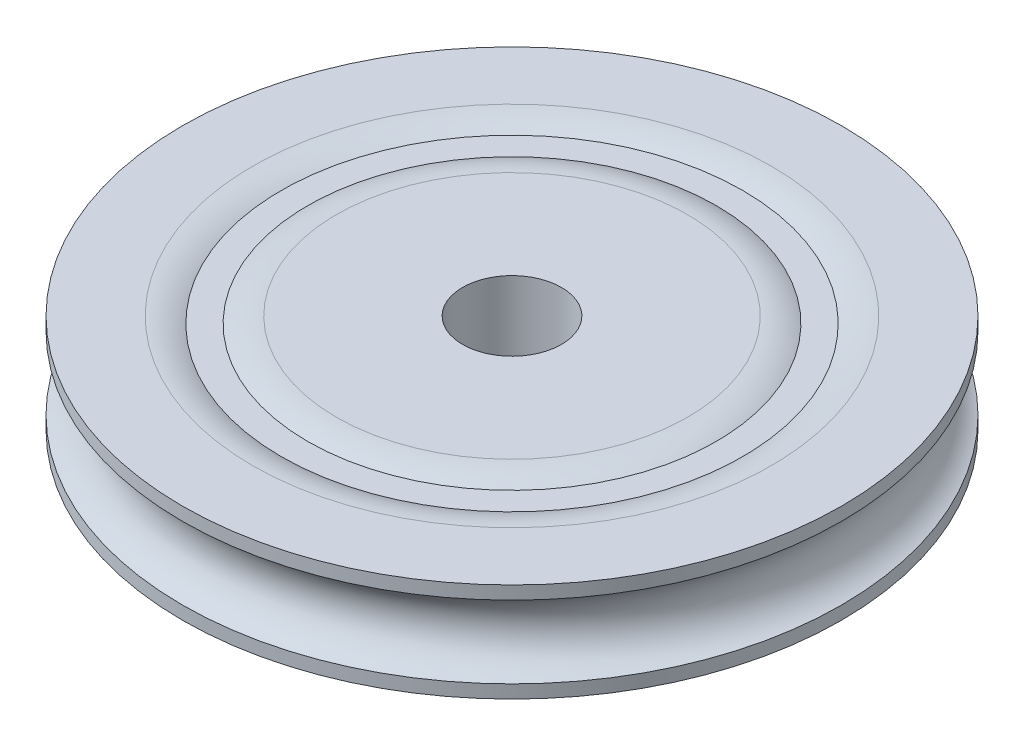
ISO-10303-21;
HEADER;
FILE_DESCRIPTION(('STEP AP214'),'2;1');
FILE_NAME('part.step','',(''),(''),'','','');
FILE_SCHEMA(('AUTOMOTIVE_DESIGN { 1 0 10303 214 1 1 1 1 }'));
ENDSEC;
DATA;
#1=APPLICATION_CONTEXT('core data for automotive mechanical design processes');
#2=APPLICATION_PROTOCOL_DEFINITION('international standard','automotive_design',2000,#1);
#3=PRODUCT_CONTEXT('',#1,'mechanical');
#4=PRODUCT('Part','Part','',(#3));
#5=PRODUCT_RELATED_PRODUCT_CATEGORY('part','',(#4));
#6=PRODUCT_DEFINITION_FORMATION('','',#4);
#7=PRODUCT_DEFINITION_CONTEXT('part definition',#1,'design');
#8=PRODUCT_DEFINITION('design','',#6,#7);
#9=PRODUCT_DEFINITION_SHAPE('','',#8);
#10=(LENGTH_UNIT() NAMED_UNIT(*) SI_UNIT(.MILLI.,.METRE.));
#11=(NAMED_UNIT(*) PLANE_ANGLE_UNIT() SI_UNIT($,.RADIAN.));
#12=(NAMED_UNIT(*) SI_UNIT($,.STERADIAN.) SOLID_ANGLE_UNIT());
#13=UNCERTAINTY_MEASURE_WITH_UNIT(LENGTH_MEASURE(1.E-05),#10,'distance_accuracy_value','');
#14=(GEOMETRIC_REPRESENTATION_CONTEXT(3) GLOBAL_UNCERTAINTY_ASSIGNED_CONTEXT((#13)) GLOBAL_UNIT_ASSIGNED_CONTEXT((#10,
#11,#12)) REPRESENTATION_CONTEXT('',''));
#15=CARTESIAN_POINT('',(0.,0.,0.));
#16=DIRECTION('',(0.,0.,1.));
#17=DIRECTION('',(1.,0.,0.));
#18=AXIS2_PLACEMENT_3D('',#15,#16,#17);
#19=CARTESIAN_POINT('',(0.,-7.49999999999994,0.));
#20=DIRECTION('',(0.,-1.,0.));
#21=DIRECTION('',(0.,0.,-1.));
#22=AXIS2_PLACEMENT_3D('',#19,#20,#21);
#23=PLANE('',#22);
#24=CARTESIAN_POINT('',(0.,-7.49999999999994,0.));
#25=DIRECTION('',(0.,-1.,0.));
#26=DIRECTION('',(0.,0.,-1.));
#27=AXIS2_PLACEMENT_3D('',#24,#25,#26);
#28=CIRCLE('',#27,7.5);
#29=CARTESIAN_POINT('',(0.,-7.49999999999992,-7.50000000000003));
#30=VERTEX_POINT('',#29);
#31=EDGE_CURVE('E76',#30,#30,#28,.T.);
#32=ORIENTED_EDGE('',*,*,#31,.F.);
#33=EDGE_LOOP('',(#32));
#34=FACE_BOUND('',#33,.T.);
#35=CARTESIAN_POINT('',(0.,-7.49999999999994,0.));
#36=DIRECTION('',(0.,-1.,0.));
#37=DIRECTION('',(0.,0.,-1.));
#38=AXIS2_PLACEMENT_3D('',#35,#36,#37);
#39=CIRCLE('',#38,26.6411010564592);
#40=CARTESIAN_POINT('',(0.,-7.49999999999985,-26.6411010564593));
#41=VERTEX_POINT('',#40);
#42=EDGE_CURVE('E10',#41,#41,#39,.T.);
#43=ORIENTED_EDGE('',*,*,#42,.T.);
#44=EDGE_LOOP('',(#43));
#45=FACE_BOUND('',#44,.T.);
#46=ADVANCED_FACE('F31',(#34,#45),#23,.T.);
#47=CARTESIAN_POINT('',(0.,-6.49999999999999,31.));
#48=DIRECTION('',(0.,-1.,0.));
#49=DIRECTION('',(0.,0.,-1.));
#50=AXIS2_PLACEMENT_3D('',#47,#48,#49);
#51=PLANE('',#50);
#52=CARTESIAN_POINT('',(0.,-6.4999999999999,0.));
#53=DIRECTION('',(0.,1.,0.));
#54=DIRECTION('',(0.,0.,1.));
#55=AXIS2_PLACEMENT_3D('',#52,#53,#54);
#56=CIRCLE('',#55,31.);
#57=CARTESIAN_POINT('',(0.,-6.5,31.));
#58=VERTEX_POINT('',#57);
#59=EDGE_CURVE('E51',#58,#58,#56,.T.);
#60=ORIENTED_EDGE('',*,*,#59,.T.);
#61=EDGE_LOOP('',(#60));
#62=FACE_BOUND('',#61,.T.);
#63=CARTESIAN_POINT('',(0.,-6.49999999999988,0.));
#64=DIRECTION('',(0.,1.,0.));
#65=DIRECTION('',(0.,0.,1.));
#66=AXIS2_PLACEMENT_3D('',#63,#64,#65);
#67=CIRCLE('',#66,35.);
#68=CARTESIAN_POINT('',(0.,-6.5,35.));
#69=VERTEX_POINT('',#68);
#70=EDGE_CURVE('E54',#69,#69,#67,.T.);
#71=ORIENTED_EDGE('',*,*,#70,.F.);
#72=EDGE_LOOP('',(#71));
#73=FACE_BOUND('',#72,.T.);
#74=ADVANCED_FACE('F92',(#62,#73),#51,.T.);
#75=CARTESIAN_POINT('',(0.,-7.49999999999998,34.9999999999999));
#76=DIRECTION('',(0.,-1.,0.));
#77=DIRECTION('',(0.,0.,-1.));
#78=AXIS2_PLACEMENT_3D('',#75,#76,#77);
#79=PLANE('',#78);
#80=CARTESIAN_POINT('',(0.,-7.49999999999986,0.));
#81=DIRECTION('',(0.,-1.,0.));
#82=DIRECTION('',(0.,0.,-1.));
#83=AXIS2_PLACEMENT_3D('',#80,#81,#82);
#84=CIRCLE('',#83,39.3588989435406);
#85=CARTESIAN_POINT('',(0.,-7.49999999999972,-39.3588989435406));
#86=VERTEX_POINT('',#85);
#87=EDGE_CURVE('E38',#86,#86,#84,.F.);
#88=ORIENTED_EDGE('',*,*,#87,.T.);
#89=EDGE_LOOP('',(#88));
#90=FACE_BOUND('',#89,.T.);
#91=CARTESIAN_POINT('',(0.,-7.49999999999984,0.));
#92=DIRECTION('',(0.,1.,0.));
#93=DIRECTION('',(0.,0.,1.));
#94=AXIS2_PLACEMENT_3D('',#91,#92,#93);
#95=CIRCLE('',#94,49.9999999999999);
#96=CARTESIAN_POINT('',(0.,-7.50000000000001,49.9999999999999));
#97=VERTEX_POINT('',#96);
#98=EDGE_CURVE('E57',#97,#97,#95,.T.);
#99=ORIENTED_EDGE('',*,*,#98,.F.);
#100=EDGE_LOOP('',(#99));
#101=FACE_BOUND('',#100,.T.);
#102=ADVANCED_FACE('F97',(#90,#101),#79,.T.);
#103=CARTESIAN_POINT('',(0.,55.4349174869901,1.90155570213063E-13));
#104=DIRECTION('',(0.,1.,0.));
#105=DIRECTION('',(0.,0.,1.));
#106=AXIS2_PLACEMENT_3D('',#103,#104,#105);
#107=CYLINDRICAL_SURFACE('',#106,49.9999999999999);
#108=ORIENTED_EDGE('',*,*,#98,.T.);
#109=EDGE_LOOP('',(#108));
#110=FACE_BOUND('',#109,.T.);
#111=CARTESIAN_POINT('',(0.,-5.49999999999985,0.));
#112=DIRECTION('',(0.,1.,0.));
#113=DIRECTION('',(0.,0.,1.));
#114=AXIS2_PLACEMENT_3D('',#111,#112,#113);
#115=CIRCLE('',#114,49.9999999999999);
#116=CARTESIAN_POINT('',(0.,-5.50000000000002,49.9999999999999));
#117=VERTEX_POINT('',#116);
#118=EDGE_CURVE('E60',#117,#117,#115,.T.);
#119=ORIENTED_EDGE('',*,*,#118,.F.);
#120=EDGE_LOOP('',(#119));
#121=FACE_BOUND('',#120,.T.);
#122=ADVANCED_FACE('F159',(#110,#121),#107,.T.);
#123=CARTESIAN_POINT('',(0.,1.74043078146022E-13,0.));
#124=DIRECTION('',(0.,1.,0.));
#125=DIRECTION('',(0.,0.,1.));
#126=AXIS2_PLACEMENT_3D('',#123,#124,#125);
#127=TOROIDAL_SURFACE('',#126,52.,5.85234995535988);
#128=ORIENTED_EDGE('',*,*,#118,.T.);
#129=EDGE_LOOP('',(#128));
#130=FACE_BOUND('',#129,.T.);
#131=CARTESIAN_POINT('',(0.,5.50000000000018,0.));
#132=DIRECTION('',(0.,1.,0.));
#133=DIRECTION('',(0.,0.,1.));
#134=AXIS2_PLACEMENT_3D('',#131,#132,#133);
#135=CIRCLE('',#134,49.9999999999998);
#136=CARTESIAN_POINT('',(0.,5.50000000000001,49.9999999999999));
#137=VERTEX_POINT('',#136);
#138=EDGE_CURVE('E63',#137,#137,#135,.T.);
#139=ORIENTED_EDGE('',*,*,#138,.F.);
#140=EDGE_LOOP('',(#139));
#141=FACE_BOUND('',#140,.T.);
#142=ADVANCED_FACE('F166',(#130,#141),#127,.F.);
#143=CARTESIAN_POINT('',(0.,55.4349174869901,1.90155570213063E-13));
#144=DIRECTION('',(0.,1.,0.));
#145=DIRECTION('',(0.,0.,1.));
#146=AXIS2_PLACEMENT_3D('',#143,#144,#145);
#147=CYLINDRICAL_SURFACE('',#146,49.9999999999998);
#148=ORIENTED_EDGE('',*,*,#138,.T.);
#149=EDGE_LOOP('',(#148));
#150=FACE_BOUND('',#149,.T.);
#151=CARTESIAN_POINT('',(0.,7.50000000000018,0.));
#152=DIRECTION('',(0.,1.,0.));
#153=DIRECTION('',(0.,0.,1.));
#154=AXIS2_PLACEMENT_3D('',#151,#152,#153);
#155=CIRCLE('',#154,49.9999999999998);
#156=CARTESIAN_POINT('',(0.,7.50000000000001,49.9999999999999));
#157=VERTEX_POINT('',#156);
#158=EDGE_CURVE('E66',#157,#157,#155,.T.);
#159=ORIENTED_EDGE('',*,*,#158,.F.);
#160=EDGE_LOOP('',(#159));
#161=FACE_BOUND('',#160,.T.);
#162=ADVANCED_FACE('F175',(#150,#161),#147,.T.);
#163=CARTESIAN_POINT('',(0.,7.50000000000003,34.9999999999999));
#164=DIRECTION('',(0.,1.,0.));
#165=DIRECTION('',(0.,0.,1.));
#166=AXIS2_PLACEMENT_3D('',#163,#164,#165);
#167=PLANE('',#166);
#168=CARTESIAN_POINT('',(0.,7.50000000000015,0.));
#169=DIRECTION('',(0.,1.,0.));
#170=DIRECTION('',(0.,0.,1.));
#171=AXIS2_PLACEMENT_3D('',#168,#169,#170);
#172=CIRCLE('',#171,39.3588989435407);
#173=CARTESIAN_POINT('',(0.,7.50000000000002,39.3588989435407));
#174=VERTEX_POINT('',#173);
#175=EDGE_CURVE('E46',#174,#174,#172,.F.);
#176=ORIENTED_EDGE('',*,*,#175,.T.);
#177=EDGE_LOOP('',(#176));
#178=FACE_BOUND('',#177,.T.);
#179=ORIENTED_EDGE('',*,*,#158,.T.);
#180=EDGE_LOOP('',(#179));
#181=FACE_BOUND('',#180,.T.);
#182=ADVANCED_FACE('F184',(#178,#181),#167,.T.);
#183=CARTESIAN_POINT('',(0.,6.5,31.));
#184=DIRECTION('',(0.,1.,0.));
#185=DIRECTION('',(0.,0.,1.));
#186=AXIS2_PLACEMENT_3D('',#183,#184,#185);
#187=PLANE('',#186);
#188=CARTESIAN_POINT('',(0.,6.50000000000011,0.));
#189=DIRECTION('',(0.,1.,0.));
#190=DIRECTION('',(0.,0.,1.));
#191=AXIS2_PLACEMENT_3D('',#188,#189,#190);
#192=CIRCLE('',#191,35.);
#193=CARTESIAN_POINT('',(0.,6.49999999999999,35.));
#194=VERTEX_POINT('',#193);
#195=EDGE_CURVE('E69',#194,#194,#192,.T.);
#196=ORIENTED_EDGE('',*,*,#195,.T.);
#197=EDGE_LOOP('',(#196));
#198=FACE_BOUND('',#197,.T.);
#199=CARTESIAN_POINT('',(0.,6.5000000000001,0.));
#200=DIRECTION('',(0.,1.,0.));
#201=DIRECTION('',(0.,0.,1.));
#202=AXIS2_PLACEMENT_3D('',#199,#200,#201);
#203=CIRCLE('',#202,31.);
#204=CARTESIAN_POINT('',(0.,6.49999999999999,31.));
#205=VERTEX_POINT('',#204);
#206=EDGE_CURVE('E72',#205,#205,#203,.T.);
#207=ORIENTED_EDGE('',*,*,#206,.F.);
#208=EDGE_LOOP('',(#207));
#209=FACE_BOUND('',#208,.T.);
#210=ADVANCED_FACE('F135',(#198,#209),#187,.T.);
#211=CARTESIAN_POINT('',(0.,7.50000000000005,0.));
#212=DIRECTION('',(0.,1.,0.));
#213=DIRECTION('',(0.,0.,1.));
#214=AXIS2_PLACEMENT_3D('',#211,#212,#213);
#215=PLANE('',#214);
#216=CARTESIAN_POINT('',(0.,7.50000000000019,0.));
#217=DIRECTION('',(0.,-1.,0.));
#218=DIRECTION('',(0.,0.,-1.));
#219=AXIS2_PLACEMENT_3D('',#216,#217,#218);
#220=CIRCLE('',#219,7.5);
#221=CARTESIAN_POINT('',(0.,7.50000000000021,-7.49999999999997));
#222=VERTEX_POINT('',#221);
#223=EDGE_CURVE('E75',#222,#222,#220,.T.);
#224=ORIENTED_EDGE('',*,*,#223,.T.);
#225=EDGE_LOOP('',(#224));
#226=FACE_BOUND('',#225,.T.);
#227=CARTESIAN_POINT('',(0.,7.50000000000005,0.));
#228=DIRECTION('',(0.,1.,0.));
#229=DIRECTION('',(0.,0.,1.));
#230=AXIS2_PLACEMENT_3D('',#227,#228,#229);
#231=CIRCLE('',#230,26.6411010564594);
#232=CARTESIAN_POINT('',(0.,7.49999999999996,26.6411010564595));
#233=VERTEX_POINT('',#232);
#234=EDGE_CURVE('E42',#233,#233,#231,.T.);
#235=ORIENTED_EDGE('',*,*,#234,.T.);
#236=EDGE_LOOP('',(#235));
#237=FACE_BOUND('',#236,.T.);
#238=ADVANCED_FACE('F82',(#226,#237),#215,.T.);
#239=CARTESIAN_POINT('',(0.,-2.49999999999985,0.));
#240=DIRECTION('',(0.,1.,0.));
#241=DIRECTION('',(0.,0.,1.));
#242=AXIS2_PLACEMENT_3D('',#239,#240,#241);
#243=TOROIDAL_SURFACE('',#242,39.3588989435407,10.);
#244=ORIENTED_EDGE('',*,*,#175,.F.);
#245=EDGE_LOOP('',(#244));
#246=FACE_BOUND('',#245,.T.);
#247=ORIENTED_EDGE('',*,*,#195,.F.);
#248=EDGE_LOOP('',(#247));
#249=FACE_BOUND('',#248,.T.);
#250=ADVANCED_FACE('F102',(#246,#249),#243,.T.);
#251=CARTESIAN_POINT('',(0.,-2.49999999999995,0.));
#252=DIRECTION('',(0.,-1.,0.));
#253=DIRECTION('',(0.,0.,-1.));
#254=AXIS2_PLACEMENT_3D('',#251,#252,#253);
#255=TOROIDAL_SURFACE('',#254,26.6411010564594,10.);
#256=ORIENTED_EDGE('',*,*,#206,.T.);
#257=EDGE_LOOP('',(#256));
#258=FACE_BOUND('',#257,.T.);
#259=ORIENTED_EDGE('',*,*,#234,.F.);
#260=EDGE_LOOP('',(#259));
#261=FACE_BOUND('',#260,.T.);
#262=ADVANCED_FACE('F105',(#258,#261),#255,.T.);
#263=CARTESIAN_POINT('',(0.,2.50000000000014,0.));
#264=DIRECTION('',(0.,-1.,0.));
#265=DIRECTION('',(0.,0.,-1.));
#266=AXIS2_PLACEMENT_3D('',#263,#264,#265);
#267=TOROIDAL_SURFACE('',#266,39.3588989435406,10.);
#268=ORIENTED_EDGE('',*,*,#70,.T.);
#269=EDGE_LOOP('',(#268));
#270=FACE_BOUND('',#269,.T.);
#271=ORIENTED_EDGE('',*,*,#87,.F.);
#272=EDGE_LOOP('',(#271));
#273=FACE_BOUND('',#272,.T.);
#274=ADVANCED_FACE('F108',(#270,#273),#267,.T.);
#275=CARTESIAN_POINT('',(0.,2.50000000000005,0.));
#276=DIRECTION('',(0.,1.,0.));
#277=DIRECTION('',(0.,0.,1.));
#278=AXIS2_PLACEMENT_3D('',#275,#276,#277);
#279=TOROIDAL_SURFACE('',#278,26.6411010564592,10.);
#280=ORIENTED_EDGE('',*,*,#42,.F.);
#281=EDGE_LOOP('',(#280));
#282=FACE_BOUND('',#281,.T.);
#283=ORIENTED_EDGE('',*,*,#59,.F.);
#284=EDGE_LOOP('',(#283));
#285=FACE_BOUND('',#284,.T.);
#286=ADVANCED_FACE('F33',(#282,#285),#279,.T.);
#287=CARTESIAN_POINT('',(0.,7.50000000000019,0.));
#288=DIRECTION('',(0.,-1.,0.));
#289=DIRECTION('',(0.,0.,-1.));
#290=AXIS2_PLACEMENT_3D('',#287,#288,#289);
#291=CYLINDRICAL_SURFACE('',#290,7.5);
#292=ORIENTED_EDGE('',*,*,#223,.F.);
#293=EDGE_LOOP('',(#292));
#294=FACE_BOUND('',#293,.T.);
#295=ORIENTED_EDGE('',*,*,#31,.T.);
#296=EDGE_LOOP('',(#295));
#297=FACE_BOUND('',#296,.T.);
#298=ADVANCED_FACE('F85',(#294,#297),#291,.F.);
#299=CLOSED_SHELL('',(#46,#74,#102,#122,#142,#162,#182,#210,#238,#250,#262,#274,#286,#298));
#300=MANIFOLD_SOLID_BREP('B2',#299);
#301=ADVANCED_BREP_SHAPE_REPRESENTATION('',(#18,#300),#14);
#302=SHAPE_DEFINITION_REPRESENTATION(#9,#301);
ENDSEC;
END-ISO-10303-21;
